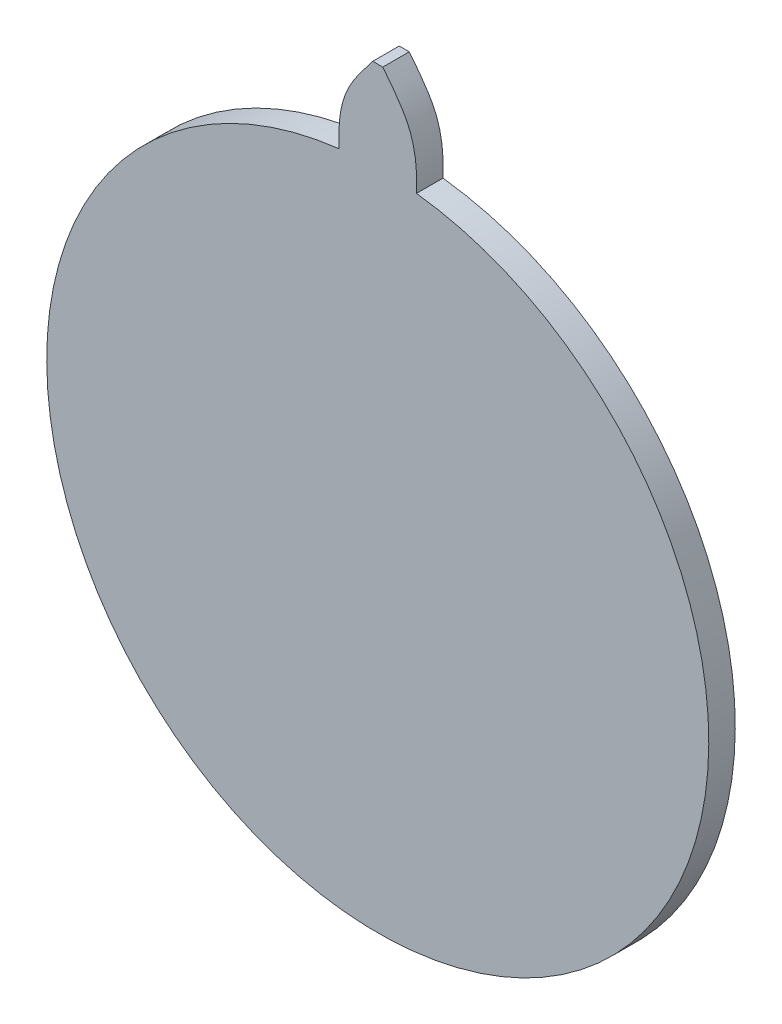
ISO-10303-21;
HEADER;
FILE_DESCRIPTION(('STEP AP214'),'2;1');
FILE_NAME('part.step','',(''),(''),'','','');
FILE_SCHEMA(('AUTOMOTIVE_DESIGN { 1 0 10303 214 1 1 1 1 }'));
ENDSEC;
DATA;
#1=APPLICATION_CONTEXT('core data for automotive mechanical design processes');
#2=APPLICATION_PROTOCOL_DEFINITION('international standard','automotive_design',2000,#1);
#3=PRODUCT_CONTEXT('',#1,'mechanical');
#4=PRODUCT('Part','Part','',(#3));
#5=PRODUCT_RELATED_PRODUCT_CATEGORY('part','',(#4));
#6=PRODUCT_DEFINITION_FORMATION('','',#4);
#7=PRODUCT_DEFINITION_CONTEXT('part definition',#1,'design');
#8=PRODUCT_DEFINITION('design','',#6,#7);
#9=PRODUCT_DEFINITION_SHAPE('','',#8);
#10=(LENGTH_UNIT() NAMED_UNIT(*) SI_UNIT(.MILLI.,.METRE.));
#11=(NAMED_UNIT(*) PLANE_ANGLE_UNIT() SI_UNIT($,.RADIAN.));
#12=(NAMED_UNIT(*) SI_UNIT($,.STERADIAN.) SOLID_ANGLE_UNIT());
#13=UNCERTAINTY_MEASURE_WITH_UNIT(LENGTH_MEASURE(1.E-05),#10,'distance_accuracy_value','');
#14=(GEOMETRIC_REPRESENTATION_CONTEXT(3) GLOBAL_UNCERTAINTY_ASSIGNED_CONTEXT((#13)) GLOBAL_UNIT_ASSIGNED_CONTEXT((#10,
#11,#12)) REPRESENTATION_CONTEXT('',''));
#15=CARTESIAN_POINT('',(0.,0.,0.));
#16=DIRECTION('',(0.,0.,1.));
#17=DIRECTION('',(1.,0.,0.));
#18=AXIS2_PLACEMENT_3D('',#15,#16,#17);
#19=CARTESIAN_POINT('',(0.,0.,2.79399985447526));
#20=DIRECTION('',(0.,0.,-1.));
#21=DIRECTION('',(-1.,0.,0.));
#22=AXIS2_PLACEMENT_3D('',#19,#20,#21);
#23=CYLINDRICAL_SURFACE('',#22,34.9334962666035);
#24=DIRECTION('',(0.,0.,-1.));
#25=VECTOR('',#24,1.);
#26=CARTESIAN_POINT('',(-4.08542641986639,34.6937811772752,2.79399985447526));
#27=LINE('',#26,#25);
#28=CARTESIAN_POINT('',(-4.08542641986639,34.6937811772752,0.));
#29=VERTEX_POINT('',#28);
#30=CARTESIAN_POINT('',(-4.08542641986639,34.6937811772752,2.79399985447526));
#31=VERTEX_POINT('',#30);
#32=EDGE_CURVE('E115',#29,#31,#27,.F.);
#33=ORIENTED_EDGE('',*,*,#32,.F.);
#34=CARTESIAN_POINT('',(0.,0.,0.));
#35=DIRECTION('',(0.,0.,1.));
#36=DIRECTION('',(1.,0.,0.));
#37=AXIS2_PLACEMENT_3D('',#34,#35,#36);
#38=CIRCLE('',#37,34.9334962666035);
#39=CARTESIAN_POINT('',(4.08542641986639,34.6937811772752,0.));
#40=VERTEX_POINT('',#39);
#41=EDGE_CURVE('E36',#29,#40,#38,.T.);
#42=ORIENTED_EDGE('',*,*,#41,.T.);
#43=DIRECTION('',(0.,0.,-1.));
#44=VECTOR('',#43,1.);
#45=CARTESIAN_POINT('',(4.08542641986639,34.6937811772752,2.79399985447526));
#46=LINE('',#45,#44);
#47=CARTESIAN_POINT('',(4.08542641986639,34.6937811772752,2.79399985447526));
#48=VERTEX_POINT('',#47);
#49=EDGE_CURVE('E50',#48,#40,#46,.T.);
#50=ORIENTED_EDGE('',*,*,#49,.F.);
#51=CARTESIAN_POINT('',(0.,0.,2.79399985447526));
#52=DIRECTION('',(0.,0.,1.));
#53=DIRECTION('',(1.,0.,0.));
#54=AXIS2_PLACEMENT_3D('',#51,#52,#53);
#55=CIRCLE('',#54,34.9334962666035);
#56=EDGE_CURVE('E11',#31,#48,#55,.T.);
#57=ORIENTED_EDGE('',*,*,#56,.F.);
#58=EDGE_LOOP('',(#33,#42,#50,#57));
#59=FACE_BOUND('',#58,.T.);
#60=ADVANCED_FACE('F33',(#59),#23,.T.);
#61=CARTESIAN_POINT('',(0.,0.,2.79399985447526));
#62=DIRECTION('',(0.,0.,1.));
#63=DIRECTION('',(1.,0.,0.));
#64=AXIS2_PLACEMENT_3D('',#61,#62,#63);
#65=PLANE('',#64);
#66=ORIENTED_EDGE('',*,*,#56,.T.);
#67=CARTESIAN_POINT('',(3.65004642896978,30.4813705897073,2.79399985447526));
#68=CARTESIAN_POINT('',(4.0956088961521,33.9061170475346,2.79399985447526));
#69=CARTESIAN_POINT('',(4.77306458015008,39.1132745731205,2.79399985447526));
#70=CARTESIAN_POINT('',(1.61149966381415,43.0971363590586,2.79399985447526));
#71=CARTESIAN_POINT('',(0.529295357409865,44.460813049227,2.79399985447526));
#72=B_SPLINE_CURVE_WITH_KNOTS('',3,(#67,#68,#69,#70,#71),.UNSPECIFIED.,.F.,.F.,(4,1,4),(0.,
0.657699798978508,1.),.UNSPECIFIED.);
#73=CARTESIAN_POINT('',(0.529295357409865,44.460813049227,2.79399985447526));
#74=VERTEX_POINT('',#73);
#75=EDGE_CURVE('E69',#48,#74,#72,.T.);
#76=ORIENTED_EDGE('',*,*,#75,.T.);
#77=DIRECTION('',(-1.,0.,0.));
#78=VECTOR('',#77,1.);
#79=CARTESIAN_POINT('',(-0.529295357409865,44.460813049227,2.79399985447526));
#80=LINE('',#79,#78);
#81=CARTESIAN_POINT('',(-0.529295357409865,44.460813049227,2.79399985447526));
#82=VERTEX_POINT('',#81);
#83=EDGE_CURVE('E74',#74,#82,#80,.T.);
#84=ORIENTED_EDGE('',*,*,#83,.T.);
#85=CARTESIAN_POINT('',(-0.529295357409865,44.460813049227,2.79399985447526));
#86=CARTESIAN_POINT('',(-1.61149966381415,43.0971363590586,2.79399985447526));
#87=CARTESIAN_POINT('',(-4.77306458015009,39.1132745731205,2.79399985447526));
#88=CARTESIAN_POINT('',(-4.0956088961521,33.9061170475346,2.79399985447526));
#89=CARTESIAN_POINT('',(-3.65004642896977,30.4813705897073,2.79399985447526));
#90=B_SPLINE_CURVE_WITH_KNOTS('',3,(#85,#86,#87,#88,#89),.UNSPECIFIED.,.F.,.F.,(4,1,4),(0.,
0.342300201021492,1.),.UNSPECIFIED.);
#91=EDGE_CURVE('E77',#82,#31,#90,.T.);
#92=ORIENTED_EDGE('',*,*,#91,.T.);
#93=EDGE_LOOP('',(#66,#76,#84,#92));
#94=FACE_BOUND('',#93,.T.);
#95=ADVANCED_FACE('F71',(#94),#65,.T.);
#96=CARTESIAN_POINT('',(0.,0.,0.));
#97=DIRECTION('',(0.,0.,1.));
#98=DIRECTION('',(1.,0.,0.));
#99=AXIS2_PLACEMENT_3D('',#96,#97,#98);
#100=PLANE('',#99);
#101=ORIENTED_EDGE('',*,*,#41,.F.);
#102=CARTESIAN_POINT('',(-0.529295357409865,44.460813049227,0.));
#103=CARTESIAN_POINT('',(-1.61149966381415,43.0971363590586,0.));
#104=CARTESIAN_POINT('',(-4.77306458015009,39.1132745731205,0.));
#105=CARTESIAN_POINT('',(-4.0956088961521,33.9061170475346,0.));
#106=CARTESIAN_POINT('',(-3.65004642896977,30.4813705897073,0.));
#107=B_SPLINE_CURVE_WITH_KNOTS('',3,(#102,#103,#104,#105,#106),.UNSPECIFIED.,.F.,.F.,(4,1,4),
(0.,0.342300201021492,1.),.UNSPECIFIED.);
#108=CARTESIAN_POINT('',(-0.529295357409865,44.460813049227,0.));
#109=VERTEX_POINT('',#108);
#110=EDGE_CURVE('E98',#109,#29,#107,.T.);
#111=ORIENTED_EDGE('',*,*,#110,.F.);
#112=DIRECTION('',(-1.,0.,0.));
#113=VECTOR('',#112,1.);
#114=CARTESIAN_POINT('',(-0.529295357409865,44.460813049227,0.));
#115=LINE('',#114,#113);
#116=CARTESIAN_POINT('',(0.529295357409865,44.460813049227,0.));
#117=VERTEX_POINT('',#116);
#118=EDGE_CURVE('E109',#117,#109,#115,.T.);
#119=ORIENTED_EDGE('',*,*,#118,.F.);
#120=CARTESIAN_POINT('',(3.65004642896978,30.4813705897073,0.));
#121=CARTESIAN_POINT('',(4.0956088961521,33.9061170475346,0.));
#122=CARTESIAN_POINT('',(4.77306458015008,39.1132745731205,0.));
#123=CARTESIAN_POINT('',(1.61149966381415,43.0971363590586,0.));
#124=CARTESIAN_POINT('',(0.529295357409865,44.460813049227,0.));
#125=B_SPLINE_CURVE_WITH_KNOTS('',3,(#120,#121,#122,#123,#124),.UNSPECIFIED.,.F.,.F.,(4,1,4),
(0.,0.657699798978508,1.),.UNSPECIFIED.);
#126=EDGE_CURVE('E83',#40,#117,#125,.T.);
#127=ORIENTED_EDGE('',*,*,#126,.F.);
#128=EDGE_LOOP('',(#101,#111,#119,#127));
#129=FACE_BOUND('',#128,.T.);
#130=ADVANCED_FACE('F119',(#129),#100,.F.);
#131=DIRECTION('',(0.,0.,-1.));
#132=VECTOR('',#131,1.);
#133=SURFACE_OF_LINEAR_EXTRUSION('',#90,#132);
#134=ORIENTED_EDGE('',*,*,#110,.T.);
#135=ORIENTED_EDGE('',*,*,#32,.T.);
#136=ORIENTED_EDGE('',*,*,#91,.F.);
#137=DIRECTION('',(0.,0.,-1.));
#138=VECTOR('',#137,1.);
#139=CARTESIAN_POINT('',(-0.529295357409865,44.460813049227,2.79399985447526));
#140=LINE('',#139,#138);
#141=EDGE_CURVE('E86',#82,#109,#140,.T.);
#142=ORIENTED_EDGE('',*,*,#141,.T.);
#143=EDGE_LOOP('',(#134,#135,#136,#142));
#144=FACE_BOUND('',#143,.T.);
#145=ADVANCED_FACE('F120',(#144),#133,.F.);
#146=DIRECTION('',(0.,0.,-1.));
#147=VECTOR('',#146,1.);
#148=SURFACE_OF_LINEAR_EXTRUSION('',#72,#147);
#149=ORIENTED_EDGE('',*,*,#75,.F.);
#150=ORIENTED_EDGE('',*,*,#49,.T.);
#151=ORIENTED_EDGE('',*,*,#126,.T.);
#152=DIRECTION('',(0.,0.,-1.));
#153=VECTOR('',#152,1.);
#154=CARTESIAN_POINT('',(0.529295357409865,44.460813049227,2.79399985447526));
#155=LINE('',#154,#153);
#156=EDGE_CURVE('E80',#74,#117,#155,.T.);
#157=ORIENTED_EDGE('',*,*,#156,.F.);
#158=EDGE_LOOP('',(#149,#150,#151,#157));
#159=FACE_BOUND('',#158,.T.);
#160=ADVANCED_FACE('F81',(#159),#148,.F.);
#161=CARTESIAN_POINT('',(-0.529295357409865,44.460813049227,2.79399985447526));
#162=DIRECTION('',(0.,-1.,0.));
#163=DIRECTION('',(0.,0.,-1.));
#164=AXIS2_PLACEMENT_3D('',#161,#162,#163);
#165=PLANE('',#164);
#166=ORIENTED_EDGE('',*,*,#118,.T.);
#167=ORIENTED_EDGE('',*,*,#141,.F.);
#168=ORIENTED_EDGE('',*,*,#83,.F.);
#169=ORIENTED_EDGE('',*,*,#156,.T.);
#170=EDGE_LOOP('',(#166,#167,#168,#169));
#171=FACE_BOUND('',#170,.T.);
#172=ADVANCED_FACE('F88',(#171),#165,.F.);
#173=CLOSED_SHELL('',(#60,#95,#130,#145,#160,#172));
#174=MANIFOLD_SOLID_BREP('B2',#173);
#175=ADVANCED_BREP_SHAPE_REPRESENTATION('',(#18,#174),#14);
#176=SHAPE_DEFINITION_REPRESENTATION(#9,#175);
ENDSEC;
END-ISO-10303-21;
